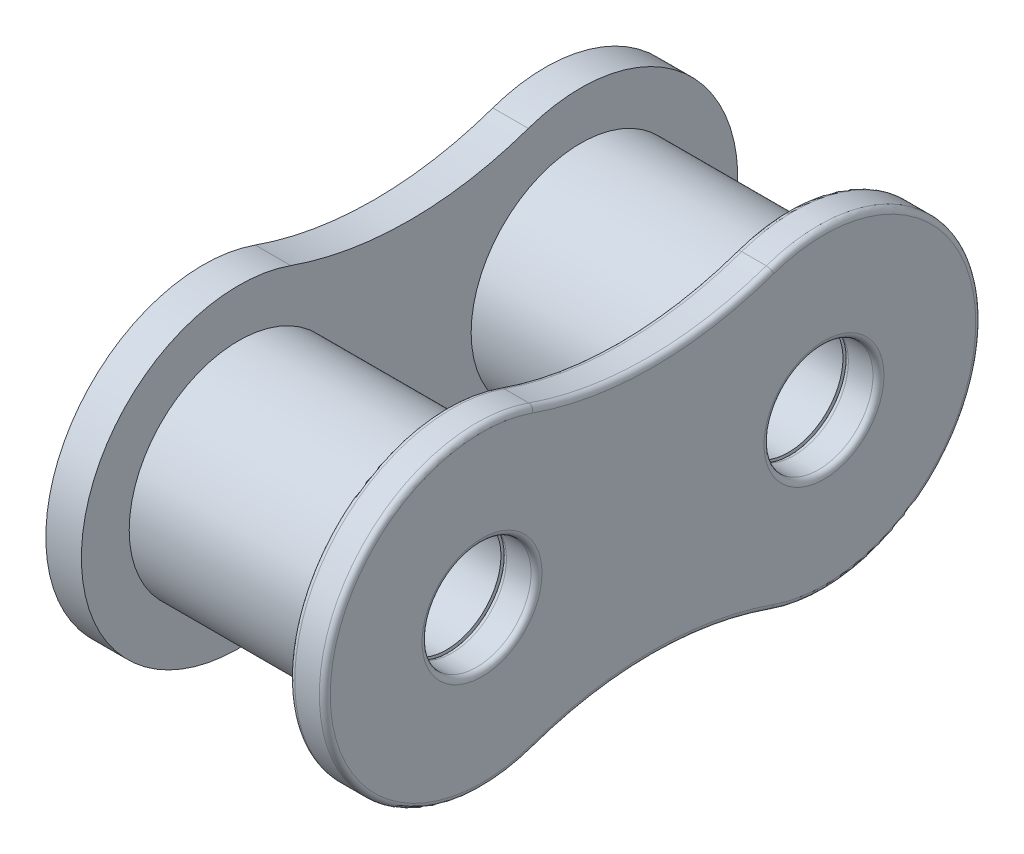
ISO-10303-21;
HEADER;
FILE_DESCRIPTION(('STEP AP214'),'2;1');
FILE_NAME('part.step','',(''),(''),'','','');
FILE_SCHEMA(('AUTOMOTIVE_DESIGN { 1 0 10303 214 1 1 1 1 }'));
ENDSEC;
DATA;
#1=APPLICATION_CONTEXT('core data for automotive mechanical design processes');
#2=APPLICATION_PROTOCOL_DEFINITION('international standard','automotive_design',2000,#1);
#3=PRODUCT_CONTEXT('',#1,'mechanical');
#4=PRODUCT('Part','Part','',(#3));
#5=PRODUCT_RELATED_PRODUCT_CATEGORY('part','',(#4));
#6=PRODUCT_DEFINITION_FORMATION('','',#4);
#7=PRODUCT_DEFINITION_CONTEXT('part definition',#1,'design');
#8=PRODUCT_DEFINITION('design','',#6,#7);
#9=PRODUCT_DEFINITION_SHAPE('','',#8);
#10=(LENGTH_UNIT() NAMED_UNIT(*) SI_UNIT(.MILLI.,.METRE.));
#11=(NAMED_UNIT(*) PLANE_ANGLE_UNIT() SI_UNIT($,.RADIAN.));
#12=(NAMED_UNIT(*) SI_UNIT($,.STERADIAN.) SOLID_ANGLE_UNIT());
#13=UNCERTAINTY_MEASURE_WITH_UNIT(LENGTH_MEASURE(1.E-05),#10,'distance_accuracy_value','');
#14=(GEOMETRIC_REPRESENTATION_CONTEXT(3) GLOBAL_UNCERTAINTY_ASSIGNED_CONTEXT((#13)) GLOBAL_UNIT_ASSIGNED_CONTEXT((#10,
#11,#12)) REPRESENTATION_CONTEXT('',''));
#15=CARTESIAN_POINT('',(0.,0.,0.));
#16=DIRECTION('',(0.,0.,1.));
#17=DIRECTION('',(1.,0.,0.));
#18=AXIS2_PLACEMENT_3D('',#15,#16,#17);
#19=CARTESIAN_POINT('',(1.65,11.275866115893,-3.96875));
#20=DIRECTION('',(1.,0.,0.));
#21=DIRECTION('',(0.,0.,-1.));
#22=AXIS2_PLACEMENT_3D('',#19,#20,#21);
#23=PLANE('',#22);
#24=CARTESIAN_POINT('',(1.65,0.,-7.9375));
#25=DIRECTION('',(1.,0.,0.));
#26=DIRECTION('',(0.,0.,-1.));
#27=AXIS2_PLACEMENT_3D('',#24,#25,#26);
#28=CIRCLE('',#27,2.784);
#29=CARTESIAN_POINT('',(1.65,0.,-10.7215));
#30=VERTEX_POINT('',#29);
#31=EDGE_CURVE('E219',#30,#30,#28,.F.);
#32=ORIENTED_EDGE('',*,*,#31,.T.);
#33=EDGE_LOOP('',(#32));
#34=FACE_BOUND('',#33,.T.);
#35=CARTESIAN_POINT('',(1.65,-22.5517322317859,0.));
#36=DIRECTION('',(1.,0.,0.));
#37=DIRECTION('',(0.,0.,-1.));
#38=AXIS2_PLACEMENT_3D('',#35,#36,#37);
#39=CIRCLE('',#38,16.8618341324381);
#40=CARTESIAN_POINT('',(1.65,-6.64633627726107,5.59819880315434));
#41=VERTEX_POINT('',#40);
#42=CARTESIAN_POINT('',(1.65,-6.64633627726107,-5.59819880315434));
#43=VERTEX_POINT('',#42);
#44=EDGE_CURVE('E214',#41,#43,#39,.F.);
#45=ORIENTED_EDGE('',*,*,#44,.T.);
#46=CARTESIAN_POINT('',(1.65,0.,-7.9375));
#47=DIRECTION('',(1.,0.,0.));
#48=DIRECTION('',(0.,0.,-1.));
#49=AXIS2_PLACEMENT_3D('',#46,#47,#48);
#50=CIRCLE('',#49,7.046);
#51=CARTESIAN_POINT('',(1.65,6.64633627726107,-5.59819880315434));
#52=VERTEX_POINT('',#51);
#53=EDGE_CURVE('E216',#43,#52,#50,.T.);
#54=ORIENTED_EDGE('',*,*,#53,.T.);
#55=CARTESIAN_POINT('',(1.65,22.5517322317859,0.));
#56=DIRECTION('',(1.,0.,0.));
#57=DIRECTION('',(0.,0.,-1.));
#58=AXIS2_PLACEMENT_3D('',#55,#56,#57);
#59=CIRCLE('',#58,16.8618341324381);
#60=CARTESIAN_POINT('',(1.65,6.64633627726107,5.59819880315434));
#61=VERTEX_POINT('',#60);
#62=EDGE_CURVE('E210',#52,#61,#59,.F.);
#63=ORIENTED_EDGE('',*,*,#62,.T.);
#64=CARTESIAN_POINT('',(1.65,0.,7.9375));
#65=DIRECTION('',(1.,0.,0.));
#66=DIRECTION('',(0.,0.,-1.));
#67=AXIS2_PLACEMENT_3D('',#64,#65,#66);
#68=CIRCLE('',#67,7.046);
#69=EDGE_CURVE('E212',#61,#41,#68,.T.);
#70=ORIENTED_EDGE('',*,*,#69,.T.);
#71=EDGE_LOOP('',(#45,#54,#63,#70));
#72=FACE_BOUND('',#71,.T.);
#73=CARTESIAN_POINT('',(1.65,0.,7.9375));
#74=DIRECTION('',(1.,0.,0.));
#75=DIRECTION('',(0.,0.,-1.));
#76=AXIS2_PLACEMENT_3D('',#73,#74,#75);
#77=CIRCLE('',#76,2.784);
#78=CARTESIAN_POINT('',(1.65,0.,5.1535));
#79=VERTEX_POINT('',#78);
#80=EDGE_CURVE('E207',#79,#79,#77,.F.);
#81=ORIENTED_EDGE('',*,*,#80,.T.);
#82=EDGE_LOOP('',(#81));
#83=FACE_BOUND('',#82,.T.);
#84=ADVANCED_FACE('F39',(#34,#72,#83),#23,.T.);
#85=CARTESIAN_POINT('',(0.,11.275866115893,-3.96875));
#86=DIRECTION('',(1.,0.,0.));
#87=DIRECTION('',(0.,0.,-1.));
#88=AXIS2_PLACEMENT_3D('',#85,#86,#87);
#89=PLANE('',#88);
#90=CARTESIAN_POINT('',(0.,0.,7.9375));
#91=DIRECTION('',(1.,0.,0.));
#92=DIRECTION('',(0.,0.,-1.));
#93=AXIS2_PLACEMENT_3D('',#90,#91,#92);
#94=CIRCLE('',#93,5.08);
#95=CARTESIAN_POINT('',(0.,0.,2.8575));
#96=VERTEX_POINT('',#95);
#97=EDGE_CURVE('E176',#96,#96,#94,.T.);
#98=ORIENTED_EDGE('',*,*,#97,.T.);
#99=EDGE_LOOP('',(#98));
#100=FACE_BOUND('',#99,.T.);
#101=CARTESIAN_POINT('',(0.,0.,-7.9375));
#102=DIRECTION('',(1.,0.,0.));
#103=DIRECTION('',(0.,0.,-1.));
#104=AXIS2_PLACEMENT_3D('',#101,#102,#103);
#105=CIRCLE('',#104,5.08);
#106=CARTESIAN_POINT('',(0.,0.,-13.0175));
#107=VERTEX_POINT('',#106);
#108=EDGE_CURVE('E11',#107,#107,#105,.F.);
#109=ORIENTED_EDGE('',*,*,#108,.F.);
#110=EDGE_LOOP('',(#109));
#111=FACE_BOUND('',#110,.T.);
#112=CARTESIAN_POINT('',(0.,-22.5517322317859,0.));
#113=DIRECTION('',(1.,0.,0.));
#114=DIRECTION('',(0.,0.,-1.));
#115=AXIS2_PLACEMENT_3D('',#112,#113,#114);
#116=CIRCLE('',#115,16.8618341324381);
#117=CARTESIAN_POINT('',(0.,-6.64633627726107,-5.59819880315434));
#118=VERTEX_POINT('',#117);
#119=CARTESIAN_POINT('',(0.,-6.64633627726107,5.59819880315434));
#120=VERTEX_POINT('',#119);
#121=EDGE_CURVE('E54',#118,#120,#116,.T.);
#122=ORIENTED_EDGE('',*,*,#121,.T.);
#123=CARTESIAN_POINT('',(0.,0.,7.9375));
#124=DIRECTION('',(1.,0.,0.));
#125=DIRECTION('',(0.,0.,-1.));
#126=AXIS2_PLACEMENT_3D('',#123,#124,#125);
#127=CIRCLE('',#126,7.046);
#128=CARTESIAN_POINT('',(0.,6.64633627726107,5.59819880315434));
#129=VERTEX_POINT('',#128);
#130=EDGE_CURVE('E250',#120,#129,#127,.F.);
#131=ORIENTED_EDGE('',*,*,#130,.T.);
#132=CARTESIAN_POINT('',(0.,22.5517322317859,0.));
#133=DIRECTION('',(1.,0.,0.));
#134=DIRECTION('',(0.,0.,-1.));
#135=AXIS2_PLACEMENT_3D('',#132,#133,#134);
#136=CIRCLE('',#135,16.8618341324381);
#137=CARTESIAN_POINT('',(0.,6.64633627726107,-5.59819880315434));
#138=VERTEX_POINT('',#137);
#139=EDGE_CURVE('E246',#129,#138,#136,.T.);
#140=ORIENTED_EDGE('',*,*,#139,.T.);
#141=CARTESIAN_POINT('',(0.,0.,-7.9375));
#142=DIRECTION('',(1.,0.,0.));
#143=DIRECTION('',(0.,0.,-1.));
#144=AXIS2_PLACEMENT_3D('',#141,#142,#143);
#145=CIRCLE('',#144,7.046);
#146=EDGE_CURVE('E59',#138,#118,#145,.F.);
#147=ORIENTED_EDGE('',*,*,#146,.T.);
#148=EDGE_LOOP('',(#122,#131,#140,#147));
#149=FACE_BOUND('',#148,.T.);
#150=ADVANCED_FACE('F288',(#100,#111,#149),#89,.F.);
#151=CARTESIAN_POINT('',(1.65,22.5517322317859,0.));
#152=DIRECTION('',(-1.,0.,0.));
#153=DIRECTION('',(0.,0.,1.));
#154=AXIS2_PLACEMENT_3D('',#151,#152,#153);
#155=CYLINDRICAL_SURFACE('',#154,16.6078341324381);
#156=DIRECTION('',(-1.,0.,0.));
#157=VECTOR('',#156,1.);
#158=CARTESIAN_POINT('',(1.65,6.88592887084953,5.51386975064245));
#159=LINE('',#158,#157);
#160=CARTESIAN_POINT('',(1.396,6.88592887084953,5.51386975064245));
#161=VERTEX_POINT('',#160);
#162=CARTESIAN_POINT('',(0.254,6.88592887084953,5.51386975064245));
#163=VERTEX_POINT('',#162);
#164=EDGE_CURVE('E198',#161,#163,#159,.T.);
#165=ORIENTED_EDGE('',*,*,#164,.F.);
#166=CARTESIAN_POINT('',(1.396,22.5517322317859,0.));
#167=DIRECTION('',(1.,0.,0.));
#168=DIRECTION('',(0.,0.,-1.));
#169=AXIS2_PLACEMENT_3D('',#166,#167,#168);
#170=CIRCLE('',#169,16.6078341324381);
#171=CARTESIAN_POINT('',(1.396,6.88592887084953,-5.51386975064245));
#172=VERTEX_POINT('',#171);
#173=EDGE_CURVE('E238',#161,#172,#170,.T.);
#174=ORIENTED_EDGE('',*,*,#173,.T.);
#175=DIRECTION('',(-1.,0.,0.));
#176=VECTOR('',#175,1.);
#177=CARTESIAN_POINT('',(1.65,6.88592887084953,-5.51386975064245));
#178=LINE('',#177,#176);
#179=CARTESIAN_POINT('',(0.254,6.88592887084953,-5.51386975064245));
#180=VERTEX_POINT('',#179);
#181=EDGE_CURVE('E188',#172,#180,#178,.T.);
#182=ORIENTED_EDGE('',*,*,#181,.T.);
#183=CARTESIAN_POINT('',(0.254,22.5517322317859,0.));
#184=DIRECTION('',(1.,0.,0.));
#185=DIRECTION('',(0.,0.,-1.));
#186=AXIS2_PLACEMENT_3D('',#183,#184,#185);
#187=CIRCLE('',#186,16.6078341324381);
#188=EDGE_CURVE('E236',#180,#163,#187,.F.);
#189=ORIENTED_EDGE('',*,*,#188,.T.);
#190=EDGE_LOOP('',(#165,#174,#182,#189));
#191=FACE_BOUND('',#190,.T.);
#192=ADVANCED_FACE('F290',(#191),#155,.F.);
#193=CARTESIAN_POINT('',(1.65,0.,7.9375));
#194=DIRECTION('',(-1.,0.,0.));
#195=DIRECTION('',(0.,0.,1.));
#196=AXIS2_PLACEMENT_3D('',#193,#194,#195);
#197=CYLINDRICAL_SURFACE('',#196,7.3);
#198=DIRECTION('',(-1.,0.,0.));
#199=VECTOR('',#198,1.);
#200=CARTESIAN_POINT('',(1.65,-6.88592887084953,5.51386975064245));
#201=LINE('',#200,#199);
#202=CARTESIAN_POINT('',(1.396,-6.88592887084953,5.51386975064245));
#203=VERTEX_POINT('',#202);
#204=CARTESIAN_POINT('',(0.254,-6.88592887084953,5.51386975064245));
#205=VERTEX_POINT('',#204);
#206=EDGE_CURVE('E195',#203,#205,#201,.T.);
#207=ORIENTED_EDGE('',*,*,#206,.F.);
#208=CARTESIAN_POINT('',(1.396,0.,7.9375));
#209=DIRECTION('',(1.,0.,0.));
#210=DIRECTION('',(0.,0.,-1.));
#211=AXIS2_PLACEMENT_3D('',#208,#209,#210);
#212=CIRCLE('',#211,7.3);
#213=EDGE_CURVE('E234',#203,#161,#212,.F.);
#214=ORIENTED_EDGE('',*,*,#213,.T.);
#215=ORIENTED_EDGE('',*,*,#164,.T.);
#216=CARTESIAN_POINT('',(0.254,0.,7.9375));
#217=DIRECTION('',(1.,0.,0.));
#218=DIRECTION('',(0.,0.,-1.));
#219=AXIS2_PLACEMENT_3D('',#216,#217,#218);
#220=CIRCLE('',#219,7.3);
#221=EDGE_CURVE('E231',#163,#205,#220,.T.);
#222=ORIENTED_EDGE('',*,*,#221,.T.);
#223=EDGE_LOOP('',(#207,#214,#215,#222));
#224=FACE_BOUND('',#223,.T.);
#225=ADVANCED_FACE('F297',(#224),#197,.T.);
#226=CARTESIAN_POINT('',(1.65,-22.5517322317859,0.));
#227=DIRECTION('',(-1.,0.,0.));
#228=DIRECTION('',(0.,0.,1.));
#229=AXIS2_PLACEMENT_3D('',#226,#227,#228);
#230=CYLINDRICAL_SURFACE('',#229,16.6078341324381);
#231=DIRECTION('',(-1.,0.,0.));
#232=VECTOR('',#231,1.);
#233=CARTESIAN_POINT('',(1.65,-6.88592887084953,-5.51386975064245));
#234=LINE('',#233,#232);
#235=CARTESIAN_POINT('',(1.396,-6.88592887084953,-5.51386975064245));
#236=VERTEX_POINT('',#235);
#237=CARTESIAN_POINT('',(0.254,-6.88592887084953,-5.51386975064245));
#238=VERTEX_POINT('',#237);
#239=EDGE_CURVE('E191',#236,#238,#234,.T.);
#240=ORIENTED_EDGE('',*,*,#239,.F.);
#241=CARTESIAN_POINT('',(1.396,-22.5517322317859,0.));
#242=DIRECTION('',(1.,0.,0.));
#243=DIRECTION('',(0.,0.,-1.));
#244=AXIS2_PLACEMENT_3D('',#241,#242,#243);
#245=CIRCLE('',#244,16.6078341324381);
#246=EDGE_CURVE('E229',#236,#203,#245,.T.);
#247=ORIENTED_EDGE('',*,*,#246,.T.);
#248=ORIENTED_EDGE('',*,*,#206,.T.);
#249=CARTESIAN_POINT('',(0.254,-22.5517322317859,0.));
#250=DIRECTION('',(1.,0.,0.));
#251=DIRECTION('',(0.,0.,-1.));
#252=AXIS2_PLACEMENT_3D('',#249,#250,#251);
#253=CIRCLE('',#252,16.6078341324381);
#254=EDGE_CURVE('E227',#205,#238,#253,.F.);
#255=ORIENTED_EDGE('',*,*,#254,.T.);
#256=EDGE_LOOP('',(#240,#247,#248,#255));
#257=FACE_BOUND('',#256,.T.);
#258=ADVANCED_FACE('F309',(#257),#230,.F.);
#259=CARTESIAN_POINT('',(1.65,0.,-7.9375));
#260=DIRECTION('',(-1.,0.,0.));
#261=DIRECTION('',(0.,0.,1.));
#262=AXIS2_PLACEMENT_3D('',#259,#260,#261);
#263=CYLINDRICAL_SURFACE('',#262,7.3);
#264=ORIENTED_EDGE('',*,*,#181,.F.);
#265=CARTESIAN_POINT('',(1.396,0.,-7.9375));
#266=DIRECTION('',(1.,0.,0.));
#267=DIRECTION('',(0.,0.,-1.));
#268=AXIS2_PLACEMENT_3D('',#265,#266,#267);
#269=CIRCLE('',#268,7.3);
#270=EDGE_CURVE('E224',#172,#236,#269,.F.);
#271=ORIENTED_EDGE('',*,*,#270,.T.);
#272=ORIENTED_EDGE('',*,*,#239,.T.);
#273=CARTESIAN_POINT('',(0.254,0.,-7.9375));
#274=DIRECTION('',(1.,0.,0.));
#275=DIRECTION('',(0.,0.,-1.));
#276=AXIS2_PLACEMENT_3D('',#273,#274,#275);
#277=CIRCLE('',#276,7.3);
#278=EDGE_CURVE('E222',#238,#180,#277,.T.);
#279=ORIENTED_EDGE('',*,*,#278,.T.);
#280=EDGE_LOOP('',(#264,#271,#272,#279));
#281=FACE_BOUND('',#280,.T.);
#282=ADVANCED_FACE('F305',(#281),#263,.T.);
#283=CARTESIAN_POINT('',(1.65,0.,7.9375));
#284=DIRECTION('',(-1.,0.,0.));
#285=DIRECTION('',(0.,0.,1.));
#286=AXIS2_PLACEMENT_3D('',#283,#284,#285);
#287=CYLINDRICAL_SURFACE('',#286,2.53);
#288=CARTESIAN_POINT('',(1.396,0.,7.9375));
#289=DIRECTION('',(1.,0.,0.));
#290=DIRECTION('',(0.,0.,-1.));
#291=AXIS2_PLACEMENT_3D('',#288,#289,#290);
#292=CIRCLE('',#291,2.53);
#293=CARTESIAN_POINT('',(1.396,0.,5.4075));
#294=VERTEX_POINT('',#293);
#295=EDGE_CURVE('E243',#294,#294,#292,.T.);
#296=ORIENTED_EDGE('',*,*,#295,.T.);
#297=EDGE_LOOP('',(#296));
#298=FACE_BOUND('',#297,.T.);
#299=CARTESIAN_POINT('',(0.254,0.,7.9375));
#300=DIRECTION('',(1.,0.,0.));
#301=DIRECTION('',(0.,0.,-1.));
#302=AXIS2_PLACEMENT_3D('',#299,#300,#301);
#303=CIRCLE('',#302,2.53);
#304=CARTESIAN_POINT('',(0.254,0.,5.4075));
#305=VERTEX_POINT('',#304);
#306=EDGE_CURVE('E240',#305,#305,#303,.F.);
#307=ORIENTED_EDGE('',*,*,#306,.T.);
#308=EDGE_LOOP('',(#307));
#309=FACE_BOUND('',#308,.T.);
#310=ADVANCED_FACE('F308',(#298,#309),#287,.F.);
#311=CARTESIAN_POINT('',(1.65,0.,-7.9375));
#312=DIRECTION('',(-1.,0.,0.));
#313=DIRECTION('',(0.,0.,1.));
#314=AXIS2_PLACEMENT_3D('',#311,#312,#313);
#315=CYLINDRICAL_SURFACE('',#314,2.53);
#316=CARTESIAN_POINT('',(1.396,0.,-7.9375));
#317=DIRECTION('',(1.,0.,0.));
#318=DIRECTION('',(0.,0.,-1.));
#319=AXIS2_PLACEMENT_3D('',#316,#317,#318);
#320=CIRCLE('',#319,2.53);
#321=CARTESIAN_POINT('',(1.396,0.,-10.4675));
#322=VERTEX_POINT('',#321);
#323=EDGE_CURVE('E204',#322,#322,#320,.T.);
#324=ORIENTED_EDGE('',*,*,#323,.T.);
#325=EDGE_LOOP('',(#324));
#326=FACE_BOUND('',#325,.T.);
#327=CARTESIAN_POINT('',(0.254,0.,-7.9375));
#328=DIRECTION('',(1.,0.,0.));
#329=DIRECTION('',(0.,0.,-1.));
#330=AXIS2_PLACEMENT_3D('',#327,#328,#329);
#331=CIRCLE('',#330,2.53);
#332=CARTESIAN_POINT('',(0.254,0.,-10.4675));
#333=VERTEX_POINT('',#332);
#334=EDGE_CURVE('E201',#333,#333,#331,.F.);
#335=ORIENTED_EDGE('',*,*,#334,.T.);
#336=EDGE_LOOP('',(#335));
#337=FACE_BOUND('',#336,.T.);
#338=ADVANCED_FACE('F321',(#326,#337),#315,.F.);
#339=CARTESIAN_POINT('',(1.396,0.,-7.9375));
#340=DIRECTION('',(1.,0.,0.));
#341=DIRECTION('',(0.,0.,-1.));
#342=AXIS2_PLACEMENT_3D('',#339,#340,#341);
#343=TOROIDAL_SURFACE('',#342,2.784,0.254);
#344=ORIENTED_EDGE('',*,*,#31,.F.);
#345=EDGE_LOOP('',(#344));
#346=FACE_BOUND('',#345,.T.);
#347=ORIENTED_EDGE('',*,*,#323,.F.);
#348=EDGE_LOOP('',(#347));
#349=FACE_BOUND('',#348,.T.);
#350=ADVANCED_FACE('F317',(#346,#349),#343,.T.);
#351=CARTESIAN_POINT('',(1.396,0.,7.9375));
#352=DIRECTION('',(1.,0.,0.));
#353=DIRECTION('',(0.,0.,-1.));
#354=AXIS2_PLACEMENT_3D('',#351,#352,#353);
#355=TOROIDAL_SURFACE('',#354,7.046,0.254);
#356=CARTESIAN_POINT('',(1.396,6.64633627726106,5.59819880315434));
#357=DIRECTION('',(0.,-0.332004143747608,-0.943277927513634));
#358=DIRECTION('',(0.,0.943277927513635,-0.332004143747608));
#359=AXIS2_PLACEMENT_3D('',#356,#357,#358);
#360=CIRCLE('',#359,0.254);
#361=EDGE_CURVE('E262',#161,#61,#360,.T.);
#362=ORIENTED_EDGE('',*,*,#361,.F.);
#363=ORIENTED_EDGE('',*,*,#213,.F.);
#364=CARTESIAN_POINT('',(1.396,-6.64633627726107,5.59819880315434));
#365=DIRECTION('',(0.,0.332004143747612,-0.943277927513633));
#366=DIRECTION('',(0.,0.943277927513633,0.332004143747612));
#367=AXIS2_PLACEMENT_3D('',#364,#365,#366);
#368=CIRCLE('',#367,0.254);
#369=EDGE_CURVE('E192',#41,#203,#368,.T.);
#370=ORIENTED_EDGE('',*,*,#369,.F.);
#371=ORIENTED_EDGE('',*,*,#69,.F.);
#372=EDGE_LOOP('',(#362,#363,#370,#371));
#373=FACE_BOUND('',#372,.T.);
#374=ADVANCED_FACE('F320',(#373),#355,.T.);
#375=CARTESIAN_POINT('',(1.396,-22.5517322317859,0.));
#376=DIRECTION('',(1.,0.,0.));
#377=DIRECTION('',(0.,0.,-1.));
#378=AXIS2_PLACEMENT_3D('',#375,#376,#377);
#379=TOROIDAL_SURFACE('',#378,16.8618341324381,0.254);
#380=ORIENTED_EDGE('',*,*,#369,.T.);
#381=ORIENTED_EDGE('',*,*,#246,.F.);
#382=CARTESIAN_POINT('',(1.396,-6.64633627726107,-5.59819880315434));
#383=DIRECTION('',(0.,-0.332004143747608,-0.943277927513634));
#384=DIRECTION('',(0.,0.943277927513634,-0.332004143747608));
#385=AXIS2_PLACEMENT_3D('',#382,#383,#384);
#386=CIRCLE('',#385,0.254);
#387=EDGE_CURVE('E259',#43,#236,#386,.T.);
#388=ORIENTED_EDGE('',*,*,#387,.F.);
#389=ORIENTED_EDGE('',*,*,#44,.F.);
#390=EDGE_LOOP('',(#380,#381,#388,#389));
#391=FACE_BOUND('',#390,.T.);
#392=ADVANCED_FACE('F331',(#391),#379,.T.);
#393=CARTESIAN_POINT('',(1.396,22.5517322317859,0.));
#394=DIRECTION('',(1.,0.,0.));
#395=DIRECTION('',(0.,0.,-1.));
#396=AXIS2_PLACEMENT_3D('',#393,#394,#395);
#397=TOROIDAL_SURFACE('',#396,16.8618341324381,0.254);
#398=ORIENTED_EDGE('',*,*,#361,.T.);
#399=ORIENTED_EDGE('',*,*,#62,.F.);
#400=CARTESIAN_POINT('',(1.396,6.64633627726107,-5.59819880315434));
#401=DIRECTION('',(0.,0.332004143747608,-0.943277927513634));
#402=DIRECTION('',(0.,0.943277927513634,0.332004143747608));
#403=AXIS2_PLACEMENT_3D('',#400,#401,#402);
#404=CIRCLE('',#403,0.254);
#405=EDGE_CURVE('E257',#172,#52,#404,.T.);
#406=ORIENTED_EDGE('',*,*,#405,.F.);
#407=ORIENTED_EDGE('',*,*,#173,.F.);
#408=EDGE_LOOP('',(#398,#399,#406,#407));
#409=FACE_BOUND('',#408,.T.);
#410=ADVANCED_FACE('F327',(#409),#397,.T.);
#411=CARTESIAN_POINT('',(1.396,0.,-7.9375));
#412=DIRECTION('',(1.,0.,0.));
#413=DIRECTION('',(0.,0.,-1.));
#414=AXIS2_PLACEMENT_3D('',#411,#412,#413);
#415=TOROIDAL_SURFACE('',#414,7.046,0.254);
#416=ORIENTED_EDGE('',*,*,#387,.T.);
#417=ORIENTED_EDGE('',*,*,#270,.F.);
#418=ORIENTED_EDGE('',*,*,#405,.T.);
#419=ORIENTED_EDGE('',*,*,#53,.F.);
#420=EDGE_LOOP('',(#416,#417,#418,#419));
#421=FACE_BOUND('',#420,.T.);
#422=ADVANCED_FACE('F323',(#421),#415,.T.);
#423=CARTESIAN_POINT('',(1.396,0.,7.9375));
#424=DIRECTION('',(1.,0.,0.));
#425=DIRECTION('',(0.,0.,-1.));
#426=AXIS2_PLACEMENT_3D('',#423,#424,#425);
#427=TOROIDAL_SURFACE('',#426,2.784,0.254);
#428=ORIENTED_EDGE('',*,*,#80,.F.);
#429=EDGE_LOOP('',(#428));
#430=FACE_BOUND('',#429,.T.);
#431=ORIENTED_EDGE('',*,*,#295,.F.);
#432=EDGE_LOOP('',(#431));
#433=FACE_BOUND('',#432,.T.);
#434=ADVANCED_FACE('F326',(#430,#433),#427,.T.);
#435=CARTESIAN_POINT('',(0.254,0.,-7.9375));
#436=DIRECTION('',(1.,0.,0.));
#437=DIRECTION('',(0.,0.,-1.));
#438=AXIS2_PLACEMENT_3D('',#435,#436,#437);
#439=TOROIDAL_SURFACE('',#438,2.784,0.254);
#440=ORIENTED_EDGE('',*,*,#334,.F.);
#441=EDGE_LOOP('',(#440));
#442=FACE_BOUND('',#441,.T.);
#443=CARTESIAN_POINT('',(0.,0.,-7.9375));
#444=DIRECTION('',(1.,0.,0.));
#445=DIRECTION('',(0.,0.,-1.));
#446=AXIS2_PLACEMENT_3D('',#443,#444,#445);
#447=CIRCLE('',#446,2.784);
#448=CARTESIAN_POINT('',(0.,0.,-10.7215));
#449=VERTEX_POINT('',#448);
#450=EDGE_CURVE('E47',#449,#449,#447,.T.);
#451=ORIENTED_EDGE('',*,*,#450,.F.);
#452=EDGE_LOOP('',(#451));
#453=FACE_BOUND('',#452,.T.);
#454=ADVANCED_FACE('F341',(#442,#453),#439,.T.);
#455=CARTESIAN_POINT('',(0.254,0.,7.9375));
#456=DIRECTION('',(1.,0.,0.));
#457=DIRECTION('',(0.,0.,-1.));
#458=AXIS2_PLACEMENT_3D('',#455,#456,#457);
#459=TOROIDAL_SURFACE('',#458,2.784,0.254);
#460=ORIENTED_EDGE('',*,*,#306,.F.);
#461=EDGE_LOOP('',(#460));
#462=FACE_BOUND('',#461,.T.);
#463=CARTESIAN_POINT('',(0.,0.,7.9375));
#464=DIRECTION('',(1.,0.,0.));
#465=DIRECTION('',(0.,0.,-1.));
#466=AXIS2_PLACEMENT_3D('',#463,#464,#465);
#467=CIRCLE('',#466,2.784);
#468=CARTESIAN_POINT('',(0.,0.,5.1535));
#469=VERTEX_POINT('',#468);
#470=EDGE_CURVE('E252',#469,#469,#467,.T.);
#471=ORIENTED_EDGE('',*,*,#470,.F.);
#472=EDGE_LOOP('',(#471));
#473=FACE_BOUND('',#472,.T.);
#474=ADVANCED_FACE('F345',(#462,#473),#459,.T.);
#475=CARTESIAN_POINT('',(0.254,0.,-7.9375));
#476=DIRECTION('',(1.,0.,0.));
#477=DIRECTION('',(0.,0.,-1.));
#478=AXIS2_PLACEMENT_3D('',#475,#476,#477);
#479=TOROIDAL_SURFACE('',#478,7.046,0.254);
#480=CARTESIAN_POINT('',(0.254,-6.64633627726107,-5.59819880315434));
#481=DIRECTION('',(0.,0.332004143747608,0.943277927513634));
#482=DIRECTION('',(0.,-0.943277927513635,0.332004143747608));
#483=AXIS2_PLACEMENT_3D('',#480,#481,#482);
#484=CIRCLE('',#483,0.254);
#485=EDGE_CURVE('E270',#118,#238,#484,.T.);
#486=ORIENTED_EDGE('',*,*,#485,.F.);
#487=ORIENTED_EDGE('',*,*,#146,.F.);
#488=CARTESIAN_POINT('',(0.254,6.64633627726106,-5.59819880315434));
#489=DIRECTION('',(0.,-0.332004143747608,0.943277927513634));
#490=DIRECTION('',(0.,-0.943277927513634,-0.332004143747608));
#491=AXIS2_PLACEMENT_3D('',#488,#489,#490);
#492=CIRCLE('',#491,0.254);
#493=EDGE_CURVE('E260',#180,#138,#492,.T.);
#494=ORIENTED_EDGE('',*,*,#493,.F.);
#495=ORIENTED_EDGE('',*,*,#278,.F.);
#496=EDGE_LOOP('',(#486,#487,#494,#495));
#497=FACE_BOUND('',#496,.T.);
#498=ADVANCED_FACE('F41',(#497),#479,.T.);
#499=CARTESIAN_POINT('',(0.254,22.5517322317859,0.));
#500=DIRECTION('',(1.,0.,0.));
#501=DIRECTION('',(0.,0.,-1.));
#502=AXIS2_PLACEMENT_3D('',#499,#500,#501);
#503=TOROIDAL_SURFACE('',#502,16.8618341324381,0.254);
#504=ORIENTED_EDGE('',*,*,#493,.T.);
#505=ORIENTED_EDGE('',*,*,#139,.F.);
#506=CARTESIAN_POINT('',(0.254,6.64633627726107,5.59819880315434));
#507=DIRECTION('',(0.,0.332004143747608,0.943277927513634));
#508=DIRECTION('',(0.,-0.943277927513634,0.332004143747608));
#509=AXIS2_PLACEMENT_3D('',#506,#507,#508);
#510=CIRCLE('',#509,0.254);
#511=EDGE_CURVE('E268',#163,#129,#510,.T.);
#512=ORIENTED_EDGE('',*,*,#511,.F.);
#513=ORIENTED_EDGE('',*,*,#188,.F.);
#514=EDGE_LOOP('',(#504,#505,#512,#513));
#515=FACE_BOUND('',#514,.T.);
#516=ADVANCED_FACE('F277',(#515),#503,.T.);
#517=CARTESIAN_POINT('',(0.254,-22.5517322317859,0.));
#518=DIRECTION('',(1.,0.,0.));
#519=DIRECTION('',(0.,0.,-1.));
#520=AXIS2_PLACEMENT_3D('',#517,#518,#519);
#521=TOROIDAL_SURFACE('',#520,16.8618341324381,0.254);
#522=ORIENTED_EDGE('',*,*,#485,.T.);
#523=ORIENTED_EDGE('',*,*,#254,.F.);
#524=CARTESIAN_POINT('',(0.254,-6.64633627726107,5.59819880315434));
#525=DIRECTION('',(0.,-0.332004143747609,0.943277927513634));
#526=DIRECTION('',(0.,-0.943277927513634,-0.332004143747609));
#527=AXIS2_PLACEMENT_3D('',#524,#525,#526);
#528=CIRCLE('',#527,0.254);
#529=EDGE_CURVE('E187',#120,#205,#528,.T.);
#530=ORIENTED_EDGE('',*,*,#529,.F.);
#531=ORIENTED_EDGE('',*,*,#121,.F.);
#532=EDGE_LOOP('',(#522,#523,#530,#531));
#533=FACE_BOUND('',#532,.T.);
#534=ADVANCED_FACE('F284',(#533),#521,.T.);
#535=CARTESIAN_POINT('',(0.254,0.,7.9375));
#536=DIRECTION('',(1.,0.,0.));
#537=DIRECTION('',(0.,0.,-1.));
#538=AXIS2_PLACEMENT_3D('',#535,#536,#537);
#539=TOROIDAL_SURFACE('',#538,7.046,0.254);
#540=ORIENTED_EDGE('',*,*,#511,.T.);
#541=ORIENTED_EDGE('',*,*,#130,.F.);
#542=ORIENTED_EDGE('',*,*,#529,.T.);
#543=ORIENTED_EDGE('',*,*,#221,.F.);
#544=EDGE_LOOP('',(#540,#541,#542,#543));
#545=FACE_BOUND('',#544,.T.);
#546=ADVANCED_FACE('F287',(#545),#539,.T.);
#547=CARTESIAN_POINT('',(0.,0.,-7.9375));
#548=DIRECTION('',(-1.,0.,0.));
#549=DIRECTION('',(0.,0.,1.));
#550=AXIS2_PLACEMENT_3D('',#547,#548,#549);
#551=PLANE('',#550);
#552=CARTESIAN_POINT('',(0.,0.,-7.9375));
#553=DIRECTION('',(-1.,0.,0.));
#554=DIRECTION('',(0.,0.,1.));
#555=AXIS2_PLACEMENT_3D('',#552,#553,#554);
#556=CIRCLE('',#555,2.53);
#557=CARTESIAN_POINT('',(0.,0.,-5.4075));
#558=VERTEX_POINT('',#557);
#559=EDGE_CURVE('E181',#558,#558,#556,.T.);
#560=ORIENTED_EDGE('',*,*,#559,.T.);
#561=EDGE_LOOP('',(#560));
#562=FACE_BOUND('',#561,.T.);
#563=ORIENTED_EDGE('',*,*,#450,.T.);
#564=EDGE_LOOP('',(#563));
#565=FACE_BOUND('',#564,.T.);
#566=ADVANCED_FACE('F352',(#562,#565),#551,.F.);
#567=CARTESIAN_POINT('',(-9.65,0.,-7.9375));
#568=DIRECTION('',(1.,0.,0.));
#569=DIRECTION('',(0.,0.,-1.));
#570=AXIS2_PLACEMENT_3D('',#567,#568,#569);
#571=CYLINDRICAL_SURFACE('',#570,5.08);
#572=CARTESIAN_POINT('',(-9.65,0.,-7.9375));
#573=DIRECTION('',(-1.,0.,0.));
#574=DIRECTION('',(0.,0.,1.));
#575=AXIS2_PLACEMENT_3D('',#572,#573,#574);
#576=CIRCLE('',#575,5.08);
#577=CARTESIAN_POINT('',(-9.65,0.,-2.8575));
#578=VERTEX_POINT('',#577);
#579=EDGE_CURVE('E184',#578,#578,#576,.T.);
#580=ORIENTED_EDGE('',*,*,#579,.F.);
#581=EDGE_LOOP('',(#580));
#582=FACE_BOUND('',#581,.T.);
#583=ORIENTED_EDGE('',*,*,#108,.T.);
#584=EDGE_LOOP('',(#583));
#585=FACE_BOUND('',#584,.T.);
#586=ADVANCED_FACE('F437',(#582,#585),#571,.T.);
#587=CARTESIAN_POINT('',(-9.65,0.,-7.9375));
#588=DIRECTION('',(1.,0.,0.));
#589=DIRECTION('',(0.,0.,-1.));
#590=AXIS2_PLACEMENT_3D('',#587,#588,#589);
#591=CYLINDRICAL_SURFACE('',#590,2.53);
#592=ORIENTED_EDGE('',*,*,#559,.F.);
#593=EDGE_LOOP('',(#592));
#594=FACE_BOUND('',#593,.T.);
#595=CARTESIAN_POINT('',(-11.3,0.,-7.9375));
#596=DIRECTION('',(1.,0.,0.));
#597=DIRECTION('',(0.,0.,1.));
#598=AXIS2_PLACEMENT_3D('',#595,#596,#597);
#599=CIRCLE('',#598,2.53);
#600=CARTESIAN_POINT('',(-11.3,0.,-5.4075));
#601=VERTEX_POINT('',#600);
#602=EDGE_CURVE('E609',#601,#601,#599,.T.);
#603=ORIENTED_EDGE('',*,*,#602,.F.);
#604=EDGE_LOOP('',(#603));
#605=FACE_BOUND('',#604,.T.);
#606=ADVANCED_FACE('F448',(#594,#605),#591,.F.);
#607=CARTESIAN_POINT('',(0.,0.,7.9375));
#608=DIRECTION('',(-1.,0.,0.));
#609=DIRECTION('',(0.,0.,-1.));
#610=AXIS2_PLACEMENT_3D('',#607,#608,#609);
#611=PLANE('',#610);
#612=CARTESIAN_POINT('',(0.,0.,7.9375));
#613=DIRECTION('',(1.,0.,0.));
#614=DIRECTION('',(0.,0.,-1.));
#615=AXIS2_PLACEMENT_3D('',#612,#613,#614);
#616=CIRCLE('',#615,2.53);
#617=CARTESIAN_POINT('',(0.,0.,5.4075));
#618=VERTEX_POINT('',#617);
#619=EDGE_CURVE('E173',#618,#618,#616,.T.);
#620=ORIENTED_EDGE('',*,*,#619,.F.);
#621=EDGE_LOOP('',(#620));
#622=FACE_BOUND('',#621,.T.);
#623=ORIENTED_EDGE('',*,*,#470,.T.);
#624=EDGE_LOOP('',(#623));
#625=FACE_BOUND('',#624,.T.);
#626=ADVANCED_FACE('F442',(#622,#625),#611,.F.);
#627=CARTESIAN_POINT('',(-9.65,0.,7.9375));
#628=DIRECTION('',(1.,0.,0.));
#629=DIRECTION('',(0.,0.,-1.));
#630=AXIS2_PLACEMENT_3D('',#627,#628,#629);
#631=CYLINDRICAL_SURFACE('',#630,5.08);
#632=CARTESIAN_POINT('',(-9.65,0.,7.9375));
#633=DIRECTION('',(1.,0.,0.));
#634=DIRECTION('',(0.,0.,-1.));
#635=AXIS2_PLACEMENT_3D('',#632,#633,#634);
#636=CIRCLE('',#635,5.08);
#637=CARTESIAN_POINT('',(-9.65,0.,2.8575));
#638=VERTEX_POINT('',#637);
#639=EDGE_CURVE('E139',#638,#638,#636,.T.);
#640=ORIENTED_EDGE('',*,*,#639,.T.);
#641=EDGE_LOOP('',(#640));
#642=FACE_BOUND('',#641,.T.);
#643=ORIENTED_EDGE('',*,*,#97,.F.);
#644=EDGE_LOOP('',(#643));
#645=FACE_BOUND('',#644,.T.);
#646=ADVANCED_FACE('F447',(#642,#645),#631,.T.);
#647=CARTESIAN_POINT('',(-9.65,0.,7.9375));
#648=DIRECTION('',(1.,0.,0.));
#649=DIRECTION('',(0.,0.,-1.));
#650=AXIS2_PLACEMENT_3D('',#647,#648,#649);
#651=CYLINDRICAL_SURFACE('',#650,2.53);
#652=ORIENTED_EDGE('',*,*,#619,.T.);
#653=EDGE_LOOP('',(#652));
#654=FACE_BOUND('',#653,.T.);
#655=CARTESIAN_POINT('',(-11.3,0.,7.9375));
#656=DIRECTION('',(1.,0.,0.));
#657=DIRECTION('',(0.,0.,-1.));
#658=AXIS2_PLACEMENT_3D('',#655,#656,#657);
#659=CIRCLE('',#658,2.53);
#660=CARTESIAN_POINT('',(-11.3,0.,5.4075));
#661=VERTEX_POINT('',#660);
#662=EDGE_CURVE('E162',#661,#661,#659,.T.);
#663=ORIENTED_EDGE('',*,*,#662,.F.);
#664=EDGE_LOOP('',(#663));
#665=FACE_BOUND('',#664,.T.);
#666=ADVANCED_FACE('F460',(#654,#665),#651,.F.);
#667=CARTESIAN_POINT('',(-9.65,11.275866115893,-3.96875));
#668=DIRECTION('',(-1.,0.,0.));
#669=DIRECTION('',(0.,0.,-1.));
#670=AXIS2_PLACEMENT_3D('',#667,#668,#669);
#671=PLANE('',#670);
#672=CARTESIAN_POINT('',(-9.65,22.5517322317859,0.));
#673=DIRECTION('',(-1.,0.,0.));
#674=DIRECTION('',(0.,0.,-1.));
#675=AXIS2_PLACEMENT_3D('',#672,#673,#674);
#676=CIRCLE('',#675,16.6078341324381);
#677=CARTESIAN_POINT('',(-9.65,6.88592887084953,-5.51386975064245));
#678=VERTEX_POINT('',#677);
#679=CARTESIAN_POINT('',(-9.65,6.88592887084953,5.51386975064245));
#680=VERTEX_POINT('',#679);
#681=EDGE_CURVE('E134',#678,#680,#676,.T.);
#682=ORIENTED_EDGE('',*,*,#681,.T.);
#683=CARTESIAN_POINT('',(-9.65,0.,7.9375));
#684=DIRECTION('',(1.,0.,0.));
#685=DIRECTION('',(0.,0.,-1.));
#686=AXIS2_PLACEMENT_3D('',#683,#684,#685);
#687=CIRCLE('',#686,7.3);
#688=CARTESIAN_POINT('',(-9.65,-6.88592887084953,5.51386975064245));
#689=VERTEX_POINT('',#688);
#690=EDGE_CURVE('E150',#680,#689,#687,.T.);
#691=ORIENTED_EDGE('',*,*,#690,.T.);
#692=CARTESIAN_POINT('',(-9.65,-22.5517322317859,0.));
#693=DIRECTION('',(-1.,0.,0.));
#694=DIRECTION('',(0.,0.,1.));
#695=AXIS2_PLACEMENT_3D('',#692,#693,#694);
#696=CIRCLE('',#695,16.6078341324381);
#697=CARTESIAN_POINT('',(-9.65,-6.88592887084953,-5.51386975064245));
#698=VERTEX_POINT('',#697);
#699=EDGE_CURVE('E164',#689,#698,#696,.T.);
#700=ORIENTED_EDGE('',*,*,#699,.T.);
#701=CARTESIAN_POINT('',(-9.65,0.,-7.9375));
#702=DIRECTION('',(1.,0.,0.));
#703=DIRECTION('',(0.,0.,1.));
#704=AXIS2_PLACEMENT_3D('',#701,#702,#703);
#705=CIRCLE('',#704,7.3);
#706=EDGE_CURVE('E161',#698,#678,#705,.T.);
#707=ORIENTED_EDGE('',*,*,#706,.T.);
#708=EDGE_LOOP('',(#682,#691,#700,#707));
#709=FACE_BOUND('',#708,.T.);
#710=ORIENTED_EDGE('',*,*,#639,.F.);
#711=EDGE_LOOP('',(#710));
#712=FACE_BOUND('',#711,.T.);
#713=ORIENTED_EDGE('',*,*,#579,.T.);
#714=EDGE_LOOP('',(#713));
#715=FACE_BOUND('',#714,.T.);
#716=ADVANCED_FACE('F479',(#709,#712,#715),#671,.F.);
#717=CARTESIAN_POINT('',(-11.3,22.5517322317859,0.));
#718=DIRECTION('',(1.,0.,0.));
#719=DIRECTION('',(0.,0.,-1.));
#720=AXIS2_PLACEMENT_3D('',#717,#718,#719);
#721=CYLINDRICAL_SURFACE('',#720,16.6078341324381);
#722=ORIENTED_EDGE('',*,*,#681,.F.);
#723=DIRECTION('',(1.,0.,0.));
#724=VECTOR('',#723,1.);
#725=CARTESIAN_POINT('',(-11.3,6.88592887084953,-5.51386975064245));
#726=LINE('',#725,#724);
#727=CARTESIAN_POINT('',(-11.3,6.88592887084953,-5.51386975064245));
#728=VERTEX_POINT('',#727);
#729=EDGE_CURVE('E128',#728,#678,#726,.T.);
#730=ORIENTED_EDGE('',*,*,#729,.F.);
#731=CARTESIAN_POINT('',(-11.3,22.5517322317859,0.));
#732=DIRECTION('',(-1.,0.,0.));
#733=DIRECTION('',(0.,0.,-1.));
#734=AXIS2_PLACEMENT_3D('',#731,#732,#733);
#735=CIRCLE('',#734,16.6078341324381);
#736=CARTESIAN_POINT('',(-11.3,6.88592887084953,5.51386975064245));
#737=VERTEX_POINT('',#736);
#738=EDGE_CURVE('E131',#728,#737,#735,.T.);
#739=ORIENTED_EDGE('',*,*,#738,.T.);
#740=DIRECTION('',(1.,0.,0.));
#741=VECTOR('',#740,1.);
#742=CARTESIAN_POINT('',(-11.3,6.88592887084953,5.51386975064245));
#743=LINE('',#742,#741);
#744=EDGE_CURVE('E159',#737,#680,#743,.T.);
#745=ORIENTED_EDGE('',*,*,#744,.T.);
#746=EDGE_LOOP('',(#722,#730,#739,#745));
#747=FACE_BOUND('',#746,.T.);
#748=ADVANCED_FACE('F130',(#747),#721,.F.);
#749=CARTESIAN_POINT('',(-11.3,0.,-7.9375));
#750=DIRECTION('',(1.,0.,0.));
#751=DIRECTION('',(0.,0.,-1.));
#752=AXIS2_PLACEMENT_3D('',#749,#750,#751);
#753=CYLINDRICAL_SURFACE('',#752,7.3);
#754=ORIENTED_EDGE('',*,*,#706,.F.);
#755=DIRECTION('',(1.,0.,0.));
#756=VECTOR('',#755,1.);
#757=CARTESIAN_POINT('',(-11.3,-6.88592887084953,-5.51386975064245));
#758=LINE('',#757,#756);
#759=CARTESIAN_POINT('',(-11.3,-6.88592887084953,-5.51386975064245));
#760=VERTEX_POINT('',#759);
#761=EDGE_CURVE('E140',#760,#698,#758,.T.);
#762=ORIENTED_EDGE('',*,*,#761,.F.);
#763=CARTESIAN_POINT('',(-11.3,0.,-7.9375));
#764=DIRECTION('',(1.,0.,0.));
#765=DIRECTION('',(0.,0.,1.));
#766=AXIS2_PLACEMENT_3D('',#763,#764,#765);
#767=CIRCLE('',#766,7.3);
#768=EDGE_CURVE('E146',#760,#728,#767,.T.);
#769=ORIENTED_EDGE('',*,*,#768,.T.);
#770=ORIENTED_EDGE('',*,*,#729,.T.);
#771=EDGE_LOOP('',(#754,#762,#769,#770));
#772=FACE_BOUND('',#771,.T.);
#773=ADVANCED_FACE('F152',(#772),#753,.T.);
#774=CARTESIAN_POINT('',(-11.3,-22.5517322317859,0.));
#775=DIRECTION('',(1.,0.,0.));
#776=DIRECTION('',(0.,0.,-1.));
#777=AXIS2_PLACEMENT_3D('',#774,#775,#776);
#778=CYLINDRICAL_SURFACE('',#777,16.6078341324381);
#779=ORIENTED_EDGE('',*,*,#699,.F.);
#780=DIRECTION('',(1.,0.,0.));
#781=VECTOR('',#780,1.);
#782=CARTESIAN_POINT('',(-11.3,-6.88592887084953,5.51386975064245));
#783=LINE('',#782,#781);
#784=CARTESIAN_POINT('',(-11.3,-6.88592887084953,5.51386975064245));
#785=VERTEX_POINT('',#784);
#786=EDGE_CURVE('E170',#785,#689,#783,.T.);
#787=ORIENTED_EDGE('',*,*,#786,.F.);
#788=CARTESIAN_POINT('',(-11.3,-22.5517322317859,0.));
#789=DIRECTION('',(-1.,0.,0.));
#790=DIRECTION('',(0.,0.,1.));
#791=AXIS2_PLACEMENT_3D('',#788,#789,#790);
#792=CIRCLE('',#791,16.6078341324381);
#793=EDGE_CURVE('E153',#785,#760,#792,.T.);
#794=ORIENTED_EDGE('',*,*,#793,.T.);
#795=ORIENTED_EDGE('',*,*,#761,.T.);
#796=EDGE_LOOP('',(#779,#787,#794,#795));
#797=FACE_BOUND('',#796,.T.);
#798=ADVANCED_FACE('F506',(#797),#778,.F.);
#799=CARTESIAN_POINT('',(-11.3,0.,7.9375));
#800=DIRECTION('',(1.,0.,0.));
#801=DIRECTION('',(0.,0.,-1.));
#802=AXIS2_PLACEMENT_3D('',#799,#800,#801);
#803=CYLINDRICAL_SURFACE('',#802,7.3);
#804=ORIENTED_EDGE('',*,*,#690,.F.);
#805=ORIENTED_EDGE('',*,*,#744,.F.);
#806=CARTESIAN_POINT('',(-11.3,0.,7.9375));
#807=DIRECTION('',(1.,0.,0.));
#808=DIRECTION('',(0.,0.,-1.));
#809=AXIS2_PLACEMENT_3D('',#806,#807,#808);
#810=CIRCLE('',#809,7.3);
#811=EDGE_CURVE('E149',#737,#785,#810,.T.);
#812=ORIENTED_EDGE('',*,*,#811,.T.);
#813=ORIENTED_EDGE('',*,*,#786,.T.);
#814=EDGE_LOOP('',(#804,#805,#812,#813));
#815=FACE_BOUND('',#814,.T.);
#816=ADVANCED_FACE('F515',(#815),#803,.T.);
#817=CARTESIAN_POINT('',(-11.3,11.275866115893,-3.96875));
#818=DIRECTION('',(-1.,0.,0.));
#819=DIRECTION('',(0.,0.,-1.));
#820=AXIS2_PLACEMENT_3D('',#817,#818,#819);
#821=PLANE('',#820);
#822=ORIENTED_EDGE('',*,*,#602,.T.);
#823=EDGE_LOOP('',(#822));
#824=FACE_BOUND('',#823,.T.);
#825=ORIENTED_EDGE('',*,*,#662,.T.);
#826=EDGE_LOOP('',(#825));
#827=FACE_BOUND('',#826,.T.);
#828=ORIENTED_EDGE('',*,*,#738,.F.);
#829=ORIENTED_EDGE('',*,*,#768,.F.);
#830=ORIENTED_EDGE('',*,*,#793,.F.);
#831=ORIENTED_EDGE('',*,*,#811,.F.);
#832=EDGE_LOOP('',(#828,#829,#830,#831));
#833=FACE_BOUND('',#832,.T.);
#834=ADVANCED_FACE('F144',(#824,#827,#833),#821,.T.);
#835=CLOSED_SHELL('',(#84,#150,#192,#225,#258,#282,#310,#338,#350,#374,#392,#410,#422,#434,#454,
#474,#498,#516,#534,#546,#566,#586,#606,#626,#646,#666,#716,#748,#773,#798,#816,#834));
#836=MANIFOLD_SOLID_BREP('B2',#835);
#837=ADVANCED_BREP_SHAPE_REPRESENTATION('',(#18,#836),#14);
#838=SHAPE_DEFINITION_REPRESENTATION(#9,#837);
ENDSEC;
END-ISO-10303-21;
